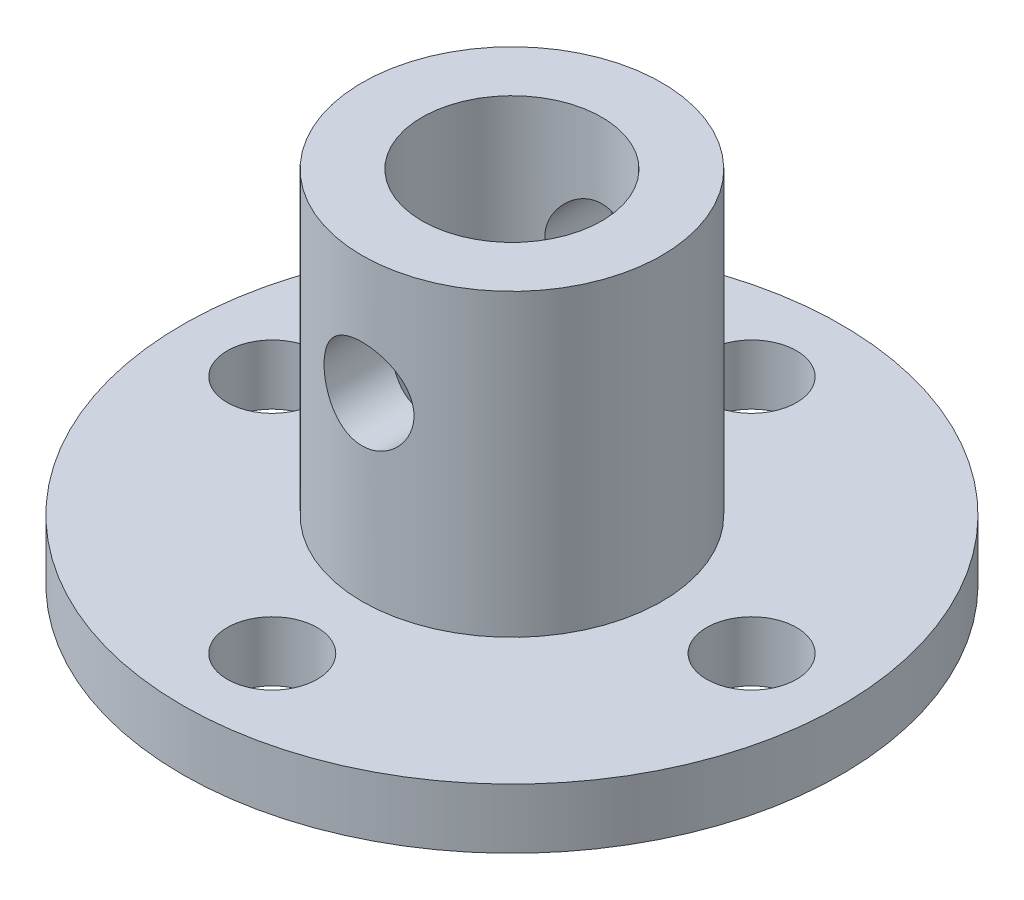
ISO-10303-21;
HEADER;
FILE_DESCRIPTION(('STEP AP214'),'2;1');
FILE_NAME('part.step','',(''),(''),'','','');
FILE_SCHEMA(('AUTOMOTIVE_DESIGN { 1 0 10303 214 1 1 1 1 }'));
ENDSEC;
DATA;
#1=APPLICATION_CONTEXT('core data for automotive mechanical design processes');
#2=APPLICATION_PROTOCOL_DEFINITION('international standard','automotive_design',2000,#1);
#3=PRODUCT_CONTEXT('',#1,'mechanical');
#4=PRODUCT('Part','Part','',(#3));
#5=PRODUCT_RELATED_PRODUCT_CATEGORY('part','',(#4));
#6=PRODUCT_DEFINITION_FORMATION('','',#4);
#7=PRODUCT_DEFINITION_CONTEXT('part definition',#1,'design');
#8=PRODUCT_DEFINITION('design','',#6,#7);
#9=PRODUCT_DEFINITION_SHAPE('','',#8);
#10=(LENGTH_UNIT() NAMED_UNIT(*) SI_UNIT(.MILLI.,.METRE.));
#11=(NAMED_UNIT(*) PLANE_ANGLE_UNIT() SI_UNIT($,.RADIAN.));
#12=(NAMED_UNIT(*) SI_UNIT($,.STERADIAN.) SOLID_ANGLE_UNIT());
#13=UNCERTAINTY_MEASURE_WITH_UNIT(LENGTH_MEASURE(1.E-05),#10,'distance_accuracy_value','');
#14=(GEOMETRIC_REPRESENTATION_CONTEXT(3) GLOBAL_UNCERTAINTY_ASSIGNED_CONTEXT((#13)) GLOBAL_UNIT_ASSIGNED_CONTEXT((#10,
#11,#12)) REPRESENTATION_CONTEXT('',''));
#15=CARTESIAN_POINT('',(0.,0.,0.));
#16=DIRECTION('',(0.,0.,1.));
#17=DIRECTION('',(1.,0.,0.));
#18=AXIS2_PLACEMENT_3D('',#15,#16,#17);
#19=CARTESIAN_POINT('',(0.,2.,0.));
#20=DIRECTION('',(0.,1.,0.));
#21=DIRECTION('',(0.,0.,1.));
#22=AXIS2_PLACEMENT_3D('',#19,#20,#21);
#23=PLANE('',#22);
#24=CARTESIAN_POINT('',(0.,2.,-8.));
#25=DIRECTION('',(0.,1.,0.));
#26=DIRECTION('',(0.,0.,1.));
#27=AXIS2_PLACEMENT_3D('',#24,#25,#26);
#28=CIRCLE('',#27,1.5);
#29=CARTESIAN_POINT('',(0.,2.,-6.5));
#30=VERTEX_POINT('',#29);
#31=EDGE_CURVE('E138',#30,#30,#28,.T.);
#32=ORIENTED_EDGE('',*,*,#31,.F.);
#33=EDGE_LOOP('',(#32));
#34=FACE_BOUND('',#33,.T.);
#35=CARTESIAN_POINT('',(0.,2.,8.));
#36=DIRECTION('',(0.,1.,0.));
#37=DIRECTION('',(0.,0.,1.));
#38=AXIS2_PLACEMENT_3D('',#35,#36,#37);
#39=CIRCLE('',#38,1.5);
#40=CARTESIAN_POINT('',(0.,2.,9.5));
#41=VERTEX_POINT('',#40);
#42=EDGE_CURVE('E156',#41,#41,#39,.T.);
#43=ORIENTED_EDGE('',*,*,#42,.F.);
#44=EDGE_LOOP('',(#43));
#45=FACE_BOUND('',#44,.T.);
#46=CARTESIAN_POINT('',(8.,2.,0.));
#47=DIRECTION('',(0.,1.,0.));
#48=DIRECTION('',(0.,0.,1.));
#49=AXIS2_PLACEMENT_3D('',#46,#47,#48);
#50=CIRCLE('',#49,1.5);
#51=CARTESIAN_POINT('',(8.,2.,1.5));
#52=VERTEX_POINT('',#51);
#53=EDGE_CURVE('E56',#52,#52,#50,.T.);
#54=ORIENTED_EDGE('',*,*,#53,.F.);
#55=EDGE_LOOP('',(#54));
#56=FACE_BOUND('',#55,.T.);
#57=CARTESIAN_POINT('',(0.,2.,0.));
#58=DIRECTION('',(0.,1.,0.));
#59=DIRECTION('',(0.,0.,1.));
#60=AXIS2_PLACEMENT_3D('',#57,#58,#59);
#61=CIRCLE('',#60,11.);
#62=CARTESIAN_POINT('',(0.,2.,11.));
#63=VERTEX_POINT('',#62);
#64=EDGE_CURVE('E10',#63,#63,#61,.T.);
#65=ORIENTED_EDGE('',*,*,#64,.T.);
#66=EDGE_LOOP('',(#65));
#67=FACE_BOUND('',#66,.T.);
#68=CARTESIAN_POINT('',(-8.,2.,0.));
#69=DIRECTION('',(0.,1.,0.));
#70=DIRECTION('',(0.,0.,1.));
#71=AXIS2_PLACEMENT_3D('',#68,#69,#70);
#72=CIRCLE('',#71,1.5);
#73=CARTESIAN_POINT('',(-8.,2.,1.5));
#74=VERTEX_POINT('',#73);
#75=EDGE_CURVE('E150',#74,#74,#72,.T.);
#76=ORIENTED_EDGE('',*,*,#75,.F.);
#77=EDGE_LOOP('',(#76));
#78=FACE_BOUND('',#77,.T.);
#79=CARTESIAN_POINT('',(0.,2.,0.));
#80=DIRECTION('',(0.,1.,0.));
#81=DIRECTION('',(0.,0.,1.));
#82=AXIS2_PLACEMENT_3D('',#79,#80,#81);
#83=CIRCLE('',#82,5.);
#84=CARTESIAN_POINT('',(0.,2.,5.));
#85=VERTEX_POINT('',#84);
#86=EDGE_CURVE('E146',#85,#85,#83,.T.);
#87=ORIENTED_EDGE('',*,*,#86,.F.);
#88=EDGE_LOOP('',(#87));
#89=FACE_BOUND('',#88,.T.);
#90=ADVANCED_FACE('F36',(#34,#45,#56,#67,#78,#89),#23,.T.);
#91=CARTESIAN_POINT('',(0.,0.,0.));
#92=DIRECTION('',(0.,1.,0.));
#93=DIRECTION('',(0.,0.,1.));
#94=AXIS2_PLACEMENT_3D('',#91,#92,#93);
#95=PLANE('',#94);
#96=CARTESIAN_POINT('',(0.,0.,0.));
#97=DIRECTION('',(0.,1.,0.));
#98=DIRECTION('',(0.,0.,1.));
#99=AXIS2_PLACEMENT_3D('',#96,#97,#98);
#100=CIRCLE('',#99,11.);
#101=CARTESIAN_POINT('',(0.,0.,11.));
#102=VERTEX_POINT('',#101);
#103=EDGE_CURVE('E50',#102,#102,#100,.T.);
#104=ORIENTED_EDGE('',*,*,#103,.F.);
#105=EDGE_LOOP('',(#104));
#106=FACE_BOUND('',#105,.T.);
#107=CARTESIAN_POINT('',(8.,0.,0.));
#108=DIRECTION('',(0.,1.,0.));
#109=DIRECTION('',(0.,0.,1.));
#110=AXIS2_PLACEMENT_3D('',#107,#108,#109);
#111=CIRCLE('',#110,1.5);
#112=CARTESIAN_POINT('',(8.,0.,1.5));
#113=VERTEX_POINT('',#112);
#114=EDGE_CURVE('E59',#113,#113,#111,.T.);
#115=ORIENTED_EDGE('',*,*,#114,.T.);
#116=EDGE_LOOP('',(#115));
#117=FACE_BOUND('',#116,.T.);
#118=CARTESIAN_POINT('',(0.,0.,0.));
#119=DIRECTION('',(0.,1.,0.));
#120=DIRECTION('',(0.,0.,1.));
#121=AXIS2_PLACEMENT_3D('',#118,#119,#120);
#122=CIRCLE('',#121,3.);
#123=CARTESIAN_POINT('',(0.,0.,3.));
#124=VERTEX_POINT('',#123);
#125=EDGE_CURVE('E124',#124,#124,#122,.T.);
#126=ORIENTED_EDGE('',*,*,#125,.T.);
#127=EDGE_LOOP('',(#126));
#128=FACE_BOUND('',#127,.T.);
#129=CARTESIAN_POINT('',(0.,0.,8.));
#130=DIRECTION('',(0.,1.,0.));
#131=DIRECTION('',(0.,0.,1.));
#132=AXIS2_PLACEMENT_3D('',#129,#130,#131);
#133=CIRCLE('',#132,1.5);
#134=CARTESIAN_POINT('',(0.,0.,9.5));
#135=VERTEX_POINT('',#134);
#136=EDGE_CURVE('E128',#135,#135,#133,.T.);
#137=ORIENTED_EDGE('',*,*,#136,.T.);
#138=EDGE_LOOP('',(#137));
#139=FACE_BOUND('',#138,.T.);
#140=CARTESIAN_POINT('',(-8.,0.,0.));
#141=DIRECTION('',(0.,1.,0.));
#142=DIRECTION('',(0.,0.,1.));
#143=AXIS2_PLACEMENT_3D('',#140,#141,#142);
#144=CIRCLE('',#143,1.5);
#145=CARTESIAN_POINT('',(-8.,0.,1.5));
#146=VERTEX_POINT('',#145);
#147=EDGE_CURVE('E132',#146,#146,#144,.T.);
#148=ORIENTED_EDGE('',*,*,#147,.T.);
#149=EDGE_LOOP('',(#148));
#150=FACE_BOUND('',#149,.T.);
#151=CARTESIAN_POINT('',(0.,0.,-8.));
#152=DIRECTION('',(0.,1.,0.));
#153=DIRECTION('',(0.,0.,1.));
#154=AXIS2_PLACEMENT_3D('',#151,#152,#153);
#155=CIRCLE('',#154,1.5);
#156=CARTESIAN_POINT('',(0.,0.,-6.5));
#157=VERTEX_POINT('',#156);
#158=EDGE_CURVE('E135',#157,#157,#155,.T.);
#159=ORIENTED_EDGE('',*,*,#158,.T.);
#160=EDGE_LOOP('',(#159));
#161=FACE_BOUND('',#160,.T.);
#162=ADVANCED_FACE('F108',(#106,#117,#128,#139,#150,#161),#95,.F.);
#163=CARTESIAN_POINT('',(0.,2.,0.));
#164=DIRECTION('',(0.,-1.,0.));
#165=DIRECTION('',(0.,0.,-1.));
#166=AXIS2_PLACEMENT_3D('',#163,#164,#165);
#167=CYLINDRICAL_SURFACE('',#166,11.);
#168=ORIENTED_EDGE('',*,*,#64,.F.);
#169=EDGE_LOOP('',(#168));
#170=FACE_BOUND('',#169,.T.);
#171=ORIENTED_EDGE('',*,*,#103,.T.);
#172=EDGE_LOOP('',(#171));
#173=FACE_BOUND('',#172,.T.);
#174=ADVANCED_FACE('F38',(#170,#173),#167,.T.);
#175=CARTESIAN_POINT('',(8.,2.,0.));
#176=DIRECTION('',(0.,-1.,0.));
#177=DIRECTION('',(0.,0.,-1.));
#178=AXIS2_PLACEMENT_3D('',#175,#176,#177);
#179=CYLINDRICAL_SURFACE('',#178,1.5);
#180=ORIENTED_EDGE('',*,*,#53,.T.);
#181=EDGE_LOOP('',(#180));
#182=FACE_BOUND('',#181,.T.);
#183=ORIENTED_EDGE('',*,*,#114,.F.);
#184=EDGE_LOOP('',(#183));
#185=FACE_BOUND('',#184,.T.);
#186=ADVANCED_FACE('F100',(#182,#185),#179,.F.);
#187=CARTESIAN_POINT('',(0.,2.,0.));
#188=DIRECTION('',(0.,-1.,0.));
#189=DIRECTION('',(0.,0.,-1.));
#190=AXIS2_PLACEMENT_3D('',#187,#188,#189);
#191=CYLINDRICAL_SURFACE('',#190,3.);
#192=CARTESIAN_POINT('',(0.,9.5,-3.));
#193=CARTESIAN_POINT('',(-0.0788579444268502,9.49999504652421,-2.99999570107562));
#194=CARTESIAN_POINT('',(-0.157809899546344,9.49374489031842,-2.99685736529635));
#195=CARTESIAN_POINT('',(-0.313380352903344,9.46902067948769,-2.98461234055736));
#196=CARTESIAN_POINT('',(-0.389994130070444,9.45052341050328,-2.97549431743379));
#197=CARTESIAN_POINT('',(-0.538400317320673,9.40220928707506,-2.95224419105063));
#198=CARTESIAN_POINT('',(-0.610210204408719,9.37243642362805,-2.93813158766306));
#199=CARTESIAN_POINT('',(-0.747708925209898,9.30264406795252,-2.90618664773642));
#200=CARTESIAN_POINT('',(-0.813398240985089,9.2626253836267,-2.88835460450288));
#201=CARTESIAN_POINT('',(-0.941261726642864,9.17072412577207,-2.84934387387093));
#202=CARTESIAN_POINT('',(-1.00298281668316,9.11827028114054,-2.82802798691306));
#203=CARTESIAN_POINT('',(-1.11716916730047,9.00421778112944,-2.78489955370115));
#204=CARTESIAN_POINT('',(-1.16962737466015,8.94261222234134,-2.76308664313552));
#205=CARTESIAN_POINT('',(-1.26787800067542,8.80627497571493,-2.71948426796021));
#206=CARTESIAN_POINT('',(-1.31283800332746,8.73089585248113,-2.69782780455198));
#207=CARTESIAN_POINT('',(-1.38925234033604,8.57244899602068,-2.65928968158481));
#208=CARTESIAN_POINT('',(-1.4207163224495,8.48938680691588,-2.64240461410484));
#209=CARTESIAN_POINT('',(-1.46719866328288,8.32300234186712,-2.61686800556713));
#210=CARTESIAN_POINT('',(-1.48308878562066,8.23999332189891,-2.6077840737557));
#211=CARTESIAN_POINT('',(-1.50064048996327,8.07203174333079,-2.59772834922792));
#212=CARTESIAN_POINT('',(-1.50231613255961,7.98708118869327,-2.59674854014932));
#213=CARTESIAN_POINT('',(-1.49203093075844,7.82857096352695,-2.60266395385873));
#214=CARTESIAN_POINT('',(-1.48167683930523,7.75486395316543,-2.6086314549302));
#215=CARTESIAN_POINT('',(-1.4504097735854,7.61041713594044,-2.62614343100775));
#216=CARTESIAN_POINT('',(-1.42949343584648,7.53967828204203,-2.63768968247664));
#217=CARTESIAN_POINT('',(-1.37731467057901,7.40115630115151,-2.66531214619112));
#218=CARTESIAN_POINT('',(-1.34582260067399,7.33348040182132,-2.68148760995998));
#219=CARTESIAN_POINT('',(-1.273562531502,7.20404856111499,-2.71655106422106));
#220=CARTESIAN_POINT('',(-1.2327903657187,7.14229529659987,-2.73544027170286));
#221=CARTESIAN_POINT('',(-1.13709908236918,7.01821812088516,-2.77669736854929));
#222=CARTESIAN_POINT('',(-1.08104168755392,6.95681468963576,-2.79920265355119));
#223=CARTESIAN_POINT('',(-0.95933336811206,6.84389687211365,-2.84321434950611));
#224=CARTESIAN_POINT('',(-0.893677884861428,6.79238721194918,-2.86472027938201));
#225=CARTESIAN_POINT('',(-0.750774758747772,6.69847150845541,-2.90552980924446));
#226=CARTESIAN_POINT('',(-0.673130387399113,6.65659929133139,-2.92468476243011));
#227=CARTESIAN_POINT('',(-0.510699323233195,6.58685445643549,-2.95736821681863));
#228=CARTESIAN_POINT('',(-0.425918364397913,6.55897072247725,-2.9709011841533));
#229=CARTESIAN_POINT('',(-0.259149737491053,6.52028689442498,-2.98986500612153));
#230=CARTESIAN_POINT('',(-0.177512295822489,6.50826314637983,-2.99587407451965));
#231=CARTESIAN_POINT('',(-0.0131693999240276,6.49780290329827,-3.00109520188655));
#232=CARTESIAN_POINT('',(0.069535529804863,6.4993599715408,-3.00031048081978));
#233=CARTESIAN_POINT('',(0.22684945797898,6.51531003262812,-2.99236788380152));
#234=CARTESIAN_POINT('',(0.301589112074895,6.52869879909499,-2.98570868532253));
#235=CARTESIAN_POINT('',(0.447610338452911,6.56635710784268,-2.9673325697226));
#236=CARTESIAN_POINT('',(0.51889152853663,6.59062784968024,-2.95561509501618));
#237=CARTESIAN_POINT('',(0.658332912674359,6.64999769964955,-2.92776377120382));
#238=CARTESIAN_POINT('',(0.726345595508704,6.68538657517443,-2.91151322654446));
#239=CARTESIAN_POINT('',(0.855692042548907,6.76566130346985,-2.87615961476126));
#240=CARTESIAN_POINT('',(0.917022944664887,6.81055120189309,-2.85705533350407));
#241=CARTESIAN_POINT('',(1.03765153393382,6.91364063799607,-2.81562332004297));
#242=CARTESIAN_POINT('',(1.09615811672854,6.97271430266772,-2.79316327265249));
#243=CARTESIAN_POINT('',(1.20278448167828,7.09988772691659,-2.7489358741323));
#244=CARTESIAN_POINT('',(1.25089707856781,7.16799367827188,-2.72716901100071));
#245=CARTESIAN_POINT('',(1.33756187171853,7.31546548125946,-2.68576788309734));
#246=CARTESIAN_POINT('',(1.37553824370037,7.39521689914172,-2.66628794383591));
#247=CARTESIAN_POINT('',(1.43712423890206,7.56126510136245,-2.63361108441202));
#248=CARTESIAN_POINT('',(1.46075237380052,7.64755328970034,-2.62040607332625));
#249=CARTESIAN_POINT('',(1.49079253120031,7.81536533432706,-2.60342251538703));
#250=CARTESIAN_POINT('',(1.49863949460818,7.89655138015286,-2.59886075197597));
#251=CARTESIAN_POINT('',(1.5010337315643,8.05917060074679,-2.59748031962405));
#252=CARTESIAN_POINT('',(1.49558676993486,8.14060365310679,-2.60065829439585));
#253=CARTESIAN_POINT('',(1.47288918838996,8.29322525230016,-2.61356793076615));
#254=CARTESIAN_POINT('',(1.45681247151455,8.36465070521711,-2.62264641723988));
#255=CARTESIAN_POINT('',(1.41476303733662,8.50371217913655,-2.64556524281479));
#256=CARTESIAN_POINT('',(1.38878713673988,8.57134697313805,-2.65940711354503));
#257=CARTESIAN_POINT('',(1.32572361795085,8.7059372764798,-2.69142795546804));
#258=CARTESIAN_POINT('',(1.28800670672355,8.77254185274354,-2.70983583593881));
#259=CARTESIAN_POINT('',(1.20322645745609,8.89891180427189,-2.74852997452291));
#260=CARTESIAN_POINT('',(1.15615825686234,8.95867359578167,-2.76881720693416));
#261=CARTESIAN_POINT('',(1.04730498999206,9.07721297353201,-2.81193484737138));
#262=CARTESIAN_POINT('',(0.98442663449589,9.13498865352544,-2.83477474959942));
#263=CARTESIAN_POINT('',(0.849232209349794,9.2393944751529,-2.87816628389896));
#264=CARTESIAN_POINT('',(0.776911084957794,9.28601860920486,-2.89871667939293));
#265=CARTESIAN_POINT('',(0.623897395174417,9.36685454406811,-2.93547014349806));
#266=CARTESIAN_POINT('',(0.543149255665095,9.4009762538547,-2.95164144740899));
#267=CARTESIAN_POINT('',(0.376113151707128,9.45471225163612,-2.9775201194848));
#268=CARTESIAN_POINT('',(0.289841699383649,9.47436777020857,-2.98724585044602));
#269=CARTESIAN_POINT('',(0.168902919736341,9.49084611662861,-2.99543192870217));
#270=CARTESIAN_POINT('',(0.135242819162346,9.49427396129951,-2.99714048010376));
#271=CARTESIAN_POINT('',(0.0677275977076369,9.49885199827113,-2.99942545465223));
#272=CARTESIAN_POINT('',(0.0338724714699424,9.50000212770531,-3.00000184655071));
#273=CARTESIAN_POINT('',(0.,9.5,-3.));
#274=B_SPLINE_CURVE_WITH_KNOTS('',3,(#192,#193,#194,#195,#196,#197,#198,#199,#200,#201,#202,
#203,#204,#205,#206,#207,#208,#209,#210,#211,#212,#213,#214,#215,#216,#217,#218,#219,#220,#221,
#222,#223,#224,#225,#226,#227,#228,#229,#230,#231,#232,#233,#234,#235,#236,#237,#238,#239,#240,
#241,#242,#243,#244,#245,#246,#247,#248,#249,#250,#251,#252,#253,#254,#255,#256,#257,#258,#259,
#260,#261,#262,#263,#264,#265,#266,#267,#268,#269,#270,#271,#272,#273),.UNSPECIFIED.,.T.,.F.,(4,
2,2,2,2,2,2,2,2,2,2,2,2,2,2,2,2,2,2,2,2,2,2,2,2,2,2,2,2,2,2,2,2,2,2,2,2,2,2,2,4),(0.,
0.236436386130439,0.473322224563796,0.709293233238448,0.945245640872351,1.19547263807713,
1.44588935648105,1.71572589646129,1.98536921847421,2.23887018210344,2.49212035993531,
2.71508568613981,2.93812205888518,3.16635360252731,3.39468781890333,3.65197412000818,
3.90938301898029,4.17874533321661,4.44789325368419,4.69474935707018,4.94148846767214,
5.16910359759183,5.39674382446397,5.63089284041848,5.86514176122509,6.12239415966628,
6.37982382923148,6.64972023242589,6.91926767918176,7.1629396125457,7.40650589797018,
7.62686895373284,7.84730293182526,8.08254685170431,8.31791341715446,8.58187864135757,
8.84598575071869,9.1119602049529,9.37717362931724,9.47872920200875,9.58028757766599),.UNSPECIFIED.);
#275=CARTESIAN_POINT('',(0.,9.5,-3.));
#276=VERTEX_POINT('',#275);
#277=EDGE_CURVE('E89',#276,#276,#274,.T.);
#278=ORIENTED_EDGE('',*,*,#277,.F.);
#279=EDGE_LOOP('',(#278));
#280=FACE_BOUND('',#279,.T.);
#281=CARTESIAN_POINT('',(1.5,8.,2.59807621135332));
#282=CARTESIAN_POINT('',(1.4999945446118,7.92183828770712,2.59808302092689));
#283=CARTESIAN_POINT('',(1.49384995609983,7.84357788271243,2.60165701781635));
#284=CARTESIAN_POINT('',(1.46958481484708,7.68945910298427,2.61543549678079));
#285=CARTESIAN_POINT('',(1.45143909683127,7.61360612743489,2.62565391083339));
#286=CARTESIAN_POINT('',(1.40414992304972,7.46682250348409,2.65124019908098));
#287=CARTESIAN_POINT('',(1.3750649287406,7.39586802128962,2.66658065209878));
#288=CARTESIAN_POINT('',(1.30690128806456,7.25986369700492,2.70063997225287));
#289=CARTESIAN_POINT('',(1.26782210105366,7.19481417460631,2.71935902214097));
#290=CARTESIAN_POINT('',(1.17699981079632,7.06654140716374,2.75995303586162));
#291=CARTESIAN_POINT('',(1.12447805421566,7.00391129648968,2.7819609545693));
#292=CARTESIAN_POINT('',(1.0098807114217,6.88788741738994,2.82557974178559));
#293=CARTESIAN_POINT('',(0.94780038867344,6.83449825612472,2.84719040746875));
#294=CARTESIAN_POINT('',(0.81073434512182,6.73494927327851,2.88932215429424));
#295=CARTESIAN_POINT('',(0.735160783518862,6.68951934821071,2.90967159627259));
#296=CARTESIAN_POINT('',(0.576235539899256,6.61228872013136,2.94526134149293));
#297=CARTESIAN_POINT('',(0.492888807207233,6.58047941579424,2.96050486775612));
#298=CARTESIAN_POINT('',(0.327067415888966,6.53374300804835,2.98320691866356));
#299=CARTESIAN_POINT('',(0.244952685733227,6.5177757104667,2.99114220331338));
#300=CARTESIAN_POINT('',(0.0788559430467724,6.49975082198744,3.00011375769101));
#301=CARTESIAN_POINT('',(-0.00512490876560767,6.49768481480643,3.00115420176885));
#302=CARTESIAN_POINT('',(-0.164748786635625,6.50712001095552,2.99644472874675));
#303=CARTESIAN_POINT('',(-0.240481798765187,6.51745702328183,2.99127743838241));
#304=CARTESIAN_POINT('',(-0.388970657877483,6.54932126585699,2.97561367889621));
#305=CARTESIAN_POINT('',(-0.461726281640888,6.57084933346434,2.96511681099591));
#306=CARTESIAN_POINT('',(-0.603464087354331,6.62462384913472,2.93957374931482));
#307=CARTESIAN_POINT('',(-0.672380135272768,6.6570144697581,2.92446662293799));
#308=CARTESIAN_POINT('',(-0.803965202269993,6.73139512430224,2.89106468980031));
#309=CARTESIAN_POINT('',(-0.866631973257969,6.77338859495352,2.87276874236226));
#310=CARTESIAN_POINT('',(-0.990260491347293,6.87034302729952,2.83266591598844));
#311=CARTESIAN_POINT('',(-1.05050111254404,6.92615454248902,2.81069063997263));
#312=CARTESIAN_POINT('',(-1.16115655544667,7.04688458739527,2.76681510880218));
#313=CARTESIAN_POINT('',(-1.21156381736135,7.11181005841109,2.74491492398443));
#314=CARTESIAN_POINT('',(-1.30425800196332,7.25397228863613,2.70216234138727));
#315=CARTESIAN_POINT('',(-1.34582597246708,7.33172903458132,2.68146479986061));
#316=CARTESIAN_POINT('',(-1.41497866950185,7.4944065070385,2.64563175417864));
#317=CARTESIAN_POINT('',(-1.44257798731633,7.57931964952634,2.63049045069101));
#318=CARTESIAN_POINT('',(-1.48077031653756,7.74682176692419,2.60916953725552));
#319=CARTESIAN_POINT('',(-1.49253768317996,7.82906167856533,2.60237483772745));
#320=CARTESIAN_POINT('',(-1.50227541991714,7.99460201227481,2.59676879042414));
#321=CARTESIAN_POINT('',(-1.50025553597254,8.07790164367968,2.59795180333967));
#322=CARTESIAN_POINT('',(-1.48355406501595,8.23348087786809,2.60751504810877));
#323=CARTESIAN_POINT('',(-1.4702817250687,8.30596917666189,2.61509381259981));
#324=CARTESIAN_POINT('',(-1.43354442694866,8.44755167940644,2.63541032327012));
#325=CARTESIAN_POINT('',(-1.41007616793542,8.51664477611991,2.64814974007551));
#326=CARTESIAN_POINT('',(-1.35247138290733,8.65311699635404,2.67804333119485));
#327=CARTESIAN_POINT('',(-1.31789109553909,8.72026852528033,2.69537464864595));
#328=CARTESIAN_POINT('',(-1.23943059602371,8.84820390730849,2.73234179245875));
#329=CARTESIAN_POINT('',(-1.19554560649832,8.90898446526992,2.75197880032721));
#330=CARTESIAN_POINT('',(-1.09325575079828,9.03046815128532,2.79431997684504));
#331=CARTESIAN_POINT('',(-1.03371790847245,9.09019572607649,2.81709874731434));
#332=CARTESIAN_POINT('',(-0.905106743097433,9.19911835699039,2.86101352466839));
#333=CARTESIAN_POINT('',(-0.83603021198302,9.24830985534581,2.88214897511564));
#334=CARTESIAN_POINT('',(-0.687803043838135,9.33586058892515,2.92112042536435));
#335=CARTESIAN_POINT('',(-0.60843464636117,9.37389967731637,2.93885462508044));
#336=CARTESIAN_POINT('',(-0.443283546961623,9.43570685578609,2.96825032438951));
#337=CARTESIAN_POINT('',(-0.357506552088264,9.45948747704946,2.9799171551456));
#338=CARTESIAN_POINT('',(-0.190469523495625,9.49005284626199,2.99501262272824));
#339=CARTESIAN_POINT('',(-0.109517165775685,9.49819681381417,2.99909891862287));
#340=CARTESIAN_POINT('',(0.0526889789268059,9.5012648981816,3.00063195562697));
#341=CARTESIAN_POINT('',(0.133942650442631,9.49619364278535,2.99808102100335));
#342=CARTESIAN_POINT('',(0.288806988475721,9.47387538980657,2.98700953256884));
#343=CARTESIAN_POINT('',(0.362568476716896,9.45745272611349,2.97889342001985));
#344=CARTESIAN_POINT('',(0.506168928275426,9.41400950104554,2.95788140495135));
#345=CARTESIAN_POINT('',(0.576007327433263,9.38698741985982,2.94498481699194));
#346=CARTESIAN_POINT('',(0.713135109367327,9.32190942175104,2.9148889612218));
#347=CARTESIAN_POINT('',(0.78018771405007,9.28343101518824,2.89752925798199));
#348=CARTESIAN_POINT('',(0.907161962721037,9.19706310371143,2.86032199712739));
#349=CARTESIAN_POINT('',(0.967080311122361,9.14916927632649,2.84047329837541));
#350=CARTESIAN_POINT('',(1.08437100623534,9.03980429146594,2.79792915339941));
#351=CARTESIAN_POINT('',(1.14089652680891,8.97745626878421,2.77514698517547));
#352=CARTESIAN_POINT('',(1.24299493109201,8.84382391830534,2.73094614244278));
#353=CARTESIAN_POINT('',(1.28855812501509,8.77253176869847,2.70952868642798));
#354=CARTESIAN_POINT('',(1.36864661967848,8.62004503012857,2.66999407957374));
#355=CARTESIAN_POINT('',(1.40277759894141,8.5386087033069,2.65200261384405));
#356=CARTESIAN_POINT('',(1.45631806425962,8.37000139349033,2.62299234492527));
#357=CARTESIAN_POINT('',(1.47577678676302,8.28285066663097,2.61195024221553));
#358=CARTESIAN_POINT('',(1.49155051179662,8.162291966522,2.60293908902686));
#359=CARTESIAN_POINT('',(1.49471415744578,8.12994815840317,2.60112193507728));
#360=CARTESIAN_POINT('',(1.49894010763494,8.06507527897663,2.59868903831625));
#361=CARTESIAN_POINT('',(1.50000227159981,8.03254619542119,2.59807337587664));
#362=CARTESIAN_POINT('',(1.5,8.,2.59807621135332));
#363=B_SPLINE_CURVE_WITH_KNOTS('',3,(#281,#282,#283,#284,#285,#286,#287,#288,#289,#290,#291,
#292,#293,#294,#295,#296,#297,#298,#299,#300,#301,#302,#303,#304,#305,#306,#307,#308,#309,#310,
#311,#312,#313,#314,#315,#316,#317,#318,#319,#320,#321,#322,#323,#324,#325,#326,#327,#328,#329,
#330,#331,#332,#333,#334,#335,#336,#337,#338,#339,#340,#341,#342,#343,#344,#345,#346,#347,#348,
#349,#350,#351,#352,#353,#354,#355,#356,#357,#358,#359,#360,#361,#362),.UNSPECIFIED.,.T.,.F.,(4,
2,2,2,2,2,2,2,2,2,2,2,2,2,2,2,2,2,2,2,2,2,2,2,2,2,2,2,2,2,2,2,2,2,2,2,2,2,2,2,4),(0.,
0.234348183892073,0.469189339237207,0.702792893878328,0.936409088167724,1.18929346874735,
1.44230356626556,1.71236838358145,1.98226240445836,2.23295227451903,2.4834903552906,
2.71224146226808,2.94100968776183,3.1729430209672,3.40495949025408,3.65890787185336,
3.91305072368878,4.18333262594173,4.45333161317557,4.70193436281317,4.95036139782559,
5.17161275136038,5.39293578654094,5.62450944609131,5.85620229330071,6.1171011537092,
6.37808797467303,6.64596272119449,6.91360169713157,7.1566840558423,7.39968130190957,
7.62666637307239,7.8536840026802,8.09041126079208,8.32724745151079,8.58765362775102,
8.84828914267732,9.11716123557908,9.38512699504141,9.48270202777964,9.58028358741811),.UNSPECIFIED.);
#364=CARTESIAN_POINT('',(1.5,8.,2.59807621135332));
#365=VERTEX_POINT('',#364);
#366=EDGE_CURVE('E82',#365,#365,#363,.T.);
#367=ORIENTED_EDGE('',*,*,#366,.F.);
#368=EDGE_LOOP('',(#367));
#369=FACE_BOUND('',#368,.T.);
#370=ORIENTED_EDGE('',*,*,#125,.F.);
#371=EDGE_LOOP('',(#370));
#372=FACE_BOUND('',#371,.T.);
#373=CARTESIAN_POINT('',(0.,12.,0.));
#374=DIRECTION('',(0.,1.,0.));
#375=DIRECTION('',(0.,0.,1.));
#376=AXIS2_PLACEMENT_3D('',#373,#374,#375);
#377=CIRCLE('',#376,3.);
#378=CARTESIAN_POINT('',(0.,12.,3.));
#379=VERTEX_POINT('',#378);
#380=EDGE_CURVE('E176',#379,#379,#377,.T.);
#381=ORIENTED_EDGE('',*,*,#380,.T.);
#382=EDGE_LOOP('',(#381));
#383=FACE_BOUND('',#382,.T.);
#384=ADVANCED_FACE('F94',(#280,#369,#372,#383),#191,.F.);
#385=CARTESIAN_POINT('',(0.,2.,8.));
#386=DIRECTION('',(0.,-1.,0.));
#387=DIRECTION('',(0.,0.,-1.));
#388=AXIS2_PLACEMENT_3D('',#385,#386,#387);
#389=CYLINDRICAL_SURFACE('',#388,1.5);
#390=ORIENTED_EDGE('',*,*,#42,.T.);
#391=EDGE_LOOP('',(#390));
#392=FACE_BOUND('',#391,.T.);
#393=ORIENTED_EDGE('',*,*,#136,.F.);
#394=EDGE_LOOP('',(#393));
#395=FACE_BOUND('',#394,.T.);
#396=ADVANCED_FACE('F99',(#392,#395),#389,.F.);
#397=CARTESIAN_POINT('',(-8.,2.,0.));
#398=DIRECTION('',(0.,-1.,0.));
#399=DIRECTION('',(0.,0.,-1.));
#400=AXIS2_PLACEMENT_3D('',#397,#398,#399);
#401=CYLINDRICAL_SURFACE('',#400,1.5);
#402=ORIENTED_EDGE('',*,*,#75,.T.);
#403=EDGE_LOOP('',(#402));
#404=FACE_BOUND('',#403,.T.);
#405=ORIENTED_EDGE('',*,*,#147,.F.);
#406=EDGE_LOOP('',(#405));
#407=FACE_BOUND('',#406,.T.);
#408=ADVANCED_FACE('F205',(#404,#407),#401,.F.);
#409=CARTESIAN_POINT('',(0.,2.,-8.));
#410=DIRECTION('',(0.,-1.,0.));
#411=DIRECTION('',(0.,0.,-1.));
#412=AXIS2_PLACEMENT_3D('',#409,#410,#411);
#413=CYLINDRICAL_SURFACE('',#412,1.5);
#414=ORIENTED_EDGE('',*,*,#31,.T.);
#415=EDGE_LOOP('',(#414));
#416=FACE_BOUND('',#415,.T.);
#417=ORIENTED_EDGE('',*,*,#158,.F.);
#418=EDGE_LOOP('',(#417));
#419=FACE_BOUND('',#418,.T.);
#420=ADVANCED_FACE('F200',(#416,#419),#413,.F.);
#421=CARTESIAN_POINT('',(0.,12.,0.));
#422=DIRECTION('',(0.,1.,0.));
#423=DIRECTION('',(0.,0.,1.));
#424=AXIS2_PLACEMENT_3D('',#421,#422,#423);
#425=PLANE('',#424);
#426=CARTESIAN_POINT('',(0.,12.,0.));
#427=DIRECTION('',(0.,1.,0.));
#428=DIRECTION('',(0.,0.,1.));
#429=AXIS2_PLACEMENT_3D('',#426,#427,#428);
#430=CIRCLE('',#429,5.);
#431=CARTESIAN_POINT('',(0.,12.,5.));
#432=VERTEX_POINT('',#431);
#433=EDGE_CURVE('E139',#432,#432,#430,.T.);
#434=ORIENTED_EDGE('',*,*,#433,.T.);
#435=EDGE_LOOP('',(#434));
#436=FACE_BOUND('',#435,.T.);
#437=ORIENTED_EDGE('',*,*,#380,.F.);
#438=EDGE_LOOP('',(#437));
#439=FACE_BOUND('',#438,.T.);
#440=ADVANCED_FACE('F76',(#436,#439),#425,.T.);
#441=CARTESIAN_POINT('',(0.,12.,0.));
#442=DIRECTION('',(0.,-1.,0.));
#443=DIRECTION('',(0.,0.,-1.));
#444=AXIS2_PLACEMENT_3D('',#441,#442,#443);
#445=CYLINDRICAL_SURFACE('',#444,5.);
#446=CARTESIAN_POINT('',(0.,9.5,-5.));
#447=CARTESIAN_POINT('',(-0.0822886127533,9.49999900251511,-4.9999992925055));
#448=CARTESIAN_POINT('',(-0.164587318351529,9.49320613637603,-4.99794915693954));
#449=CARTESIAN_POINT('',(-0.326788125304881,9.4662786457779,-4.98997105593691));
#450=CARTESIAN_POINT('',(-0.40668950441142,9.44614004197666,-4.98404193389692));
#451=CARTESIAN_POINT('',(-0.561732707754526,9.39325398308974,-4.96895552501836));
#452=CARTESIAN_POINT('',(-0.636881364395373,9.36052513038106,-4.95980300250425));
#453=CARTESIAN_POINT('',(-0.780624181053131,9.28346390694416,-4.93922109237645));
#454=CARTESIAN_POINT('',(-0.849217467469669,9.23912999260458,-4.92779140192067));
#455=CARTESIAN_POINT('',(-0.979871797183745,9.13877599252733,-4.90350737192774));
#456=CARTESIAN_POINT('',(-1.04171807124434,9.08248337411409,-4.89062383657036));
#457=CARTESIAN_POINT('',(-1.15524920923324,8.96039077008982,-4.86505834210442));
#458=CARTESIAN_POINT('',(-1.20693236327441,8.89458918787504,-4.85237641724501));
#459=CARTESIAN_POINT('',(-1.29980037723708,8.75352924696239,-4.82834113993772));
#460=CARTESIAN_POINT('',(-1.34072309022213,8.67809153900926,-4.81702406663875));
#461=CARTESIAN_POINT('',(-1.4092139477476,8.52101074576971,-4.79743620394031));
#462=CARTESIAN_POINT('',(-1.43678529919973,8.43936915607203,-4.78916468313311));
#463=CARTESIAN_POINT('',(-1.47701633682652,8.27460973386954,-4.77690870838434));
#464=CARTESIAN_POINT('',(-1.49007196234677,8.19159725613606,-4.77281069324533));
#465=CARTESIAN_POINT('',(-1.50213730614672,8.02446684378324,-4.76902789749767));
#466=CARTESIAN_POINT('',(-1.50115042761078,7.94034918194092,-4.76934204760571));
#467=CARTESIAN_POINT('',(-1.48546977199812,7.77661609139152,-4.77424744067778));
#468=CARTESIAN_POINT('',(-1.47127205262685,7.69694774963776,-4.7786838859914));
#469=CARTESIAN_POINT('',(-1.43037420427056,7.54118021372654,-4.79108356228624));
#470=CARTESIAN_POINT('',(-1.40367284141641,7.46508137262567,-4.79904714132351));
#471=CARTESIAN_POINT('',(-1.33816026653682,7.31739965033926,-4.81772733074973));
#472=CARTESIAN_POINT('',(-1.29918816934642,7.24589291604474,-4.82848016115952));
#473=CARTESIAN_POINT('',(-1.21035222588683,7.11026797798981,-4.85150987000065));
#474=CARTESIAN_POINT('',(-1.16048574002588,7.04615157058622,-4.86378711746991));
#475=CARTESIAN_POINT('',(-1.04881290765546,6.92431380923798,-4.88911011297937));
#476=CARTESIAN_POINT('',(-0.986594907466972,6.86697133597033,-4.90216654310498));
#477=CARTESIAN_POINT('',(-0.853263259313967,6.76344601593575,-4.92712244063259));
#478=CARTESIAN_POINT('',(-0.782149051860888,6.71726387158557,-4.9390218351841));
#479=CARTESIAN_POINT('',(-0.632355038342804,6.63714007753527,-4.9604316006947));
#480=CARTESIAN_POINT('',(-0.553627749747951,6.60328248375014,-4.96992543668314));
#481=CARTESIAN_POINT('',(-0.39124541560352,6.54940040990037,-4.98533521832222));
#482=CARTESIAN_POINT('',(-0.307591751589582,6.52937207146751,-4.99125216186999));
#483=CARTESIAN_POINT('',(-0.140952242668332,6.50434782210061,-4.99868364643538));
#484=CARTESIAN_POINT('',(-0.0580500976011875,6.49883841419839,-5.0003485041779));
#485=CARTESIAN_POINT('',(0.107499605823382,6.50156915571208,-4.9995292324176));
#486=CARTESIAN_POINT('',(0.19014719669078,6.50980746965144,-4.99704565677756));
#487=CARTESIAN_POINT('',(0.350903605309696,6.5393846111115,-4.98830696987163));
#488=CARTESIAN_POINT('',(0.429072772614168,6.56042338758087,-4.98213829799417));
#489=CARTESIAN_POINT('',(0.580754638954521,6.6146432327782,-4.96674347841533));
#490=CARTESIAN_POINT('',(0.654266777025583,6.64782576103786,-4.95751696321085));
#491=CARTESIAN_POINT('',(0.796437189461052,6.72625316548113,-4.93669654351325));
#492=CARTESIAN_POINT('',(0.864943826199669,6.77175934094797,-4.92505280829675));
#493=CARTESIAN_POINT('',(0.993523307980146,6.87322475405281,-4.90073468764318));
#494=CARTESIAN_POINT('',(1.05359403235593,6.92918661188767,-4.8880600443108));
#495=CARTESIAN_POINT('',(1.16585744551027,7.05238730836934,-4.86253171869138));
#496=CARTESIAN_POINT('',(1.21768481231503,7.11996187577174,-4.84968825033268));
#497=CARTESIAN_POINT('',(1.30928995072153,7.26312793901353,-4.82576515238464));
#498=CARTESIAN_POINT('',(1.34906803829472,7.33871922455821,-4.81468547654651));
#499=CARTESIAN_POINT('',(1.41517347127168,7.49553249125469,-4.79567189615055));
#500=CARTESIAN_POINT('',(1.4415634693705,7.57672618653659,-4.78772337843827));
#501=CARTESIAN_POINT('',(1.48021730815114,7.74268796893148,-4.77591594362794));
#502=CARTESIAN_POINT('',(1.49248598978779,7.82745482078767,-4.772055625083));
#503=CARTESIAN_POINT('',(1.50221984485059,7.99436151837623,-4.76899972496087));
#504=CARTESIAN_POINT('',(1.5002805530849,8.07646365101758,-4.76961647442755));
#505=CARTESIAN_POINT('',(1.48307505444813,8.2391141033728,-4.77499401288294));
#506=CARTESIAN_POINT('',(1.46780938124716,8.31966248517635,-4.77975463592551));
#507=CARTESIAN_POINT('',(1.42476888804136,8.47594539914285,-4.79275763670385));
#508=CARTESIAN_POINT('',(1.39715175507068,8.55172728736169,-4.80095604545965));
#509=CARTESIAN_POINT('',(1.33031507121129,8.69764243881772,-4.81990278909136));
#510=CARTESIAN_POINT('',(1.29109329962876,8.76777461764076,-4.83065161194312));
#511=CARTESIAN_POINT('',(1.20048763805072,8.90316311652711,-4.85397676425833));
#512=CARTESIAN_POINT('',(1.14871276092994,8.96814876126041,-4.86660540163798));
#513=CARTESIAN_POINT('',(1.03517434629782,9.08870249830786,-4.89201320450026));
#514=CARTESIAN_POINT('',(0.973408217134502,9.14426813946775,-4.90479240823905));
#515=CARTESIAN_POINT('',(0.839465762183249,9.24602341229503,-4.92950936570649));
#516=CARTESIAN_POINT('',(0.767037885790609,9.29189144685549,-4.94141159765674));
#517=CARTESIAN_POINT('',(0.615141373983531,9.37073516990402,-4.96260680455813));
#518=CARTESIAN_POINT('',(0.535676052998956,9.40371688827451,-4.97190099931067));
#519=CARTESIAN_POINT('',(0.380757712655283,9.45289527565275,-4.98602174969301));
#520=CARTESIAN_POINT('',(0.305786961954236,9.47051167288325,-4.99122027381068));
#521=CARTESIAN_POINT('',(0.15388019523078,9.49406352524158,-4.99820944494492));
#522=CARTESIAN_POINT('',(0.0769445098581401,9.50000093270482,-5.0000006615474));
#523=CARTESIAN_POINT('',(0.,9.5,-5.));
#524=B_SPLINE_CURVE_WITH_KNOTS('',3,(#446,#447,#448,#449,#450,#451,#452,#453,#454,#455,#456,
#457,#458,#459,#460,#461,#462,#463,#464,#465,#466,#467,#468,#469,#470,#471,#472,#473,#474,#475,
#476,#477,#478,#479,#480,#481,#482,#483,#484,#485,#486,#487,#488,#489,#490,#491,#492,#493,#494,
#495,#496,#497,#498,#499,#500,#501,#502,#503,#504,#505,#506,#507,#508,#509,#510,#511,#512,#513,
#514,#515,#516,#517,#518,#519,#520,#521,#522,#523),.UNSPECIFIED.,.T.,.F.,(4,2,2,2,2,2,2,2,2,2,2,
2,2,2,2,2,2,2,2,2,2,2,2,2,2,2,2,2,2,2,2,2,2,2,2,2,2,2,4),(0.,0.246583203612611,
0.493239964845999,0.739533676300874,0.985860164412702,1.23855602948191,1.49129437288633,
1.74971481004109,2.00807314543223,2.25919689356599,2.51025978319089,2.75226016697676,
2.99428443658001,3.23962426447119,3.48502360158555,3.74067104048166,3.99633456531071,
4.25371046881688,4.51101453528808,4.75908809438545,5.00712853550327,5.24956746682327,
5.49203554593728,5.74011305702908,5.98825282000191,6.24540400322818,6.5025484425268,
6.75847814951252,7.01432009460283,7.25950155466942,7.504673196616,7.74680040402721,
7.98897397553107,8.2399692567993,8.49102974897502,8.74942996156671,9.00770911595235,
9.23831691930459,9.46888616948875),.UNSPECIFIED.);
#525=CARTESIAN_POINT('',(0.,9.5,-5.));
#526=VERTEX_POINT('',#525);
#527=EDGE_CURVE('E40',#526,#526,#524,.T.);
#528=ORIENTED_EDGE('',*,*,#527,.T.);
#529=EDGE_LOOP('',(#528));
#530=FACE_BOUND('',#529,.T.);
#531=CARTESIAN_POINT('',(1.5,8.,4.76969600708473));
#532=CARTESIAN_POINT('',(1.49999897633764,7.9178054520576,4.7696968572698));
#533=CARTESIAN_POINT('',(1.49322108167142,7.83560077585598,4.77184390209069));
#534=CARTESIAN_POINT('',(1.46635844446749,7.67359475040806,4.780165783029));
#535=CARTESIAN_POINT('',(1.44626925573578,7.59379421349854,4.78634196493468));
#536=CARTESIAN_POINT('',(1.39352753269955,7.43896527172827,4.80196102485633));
#537=CARTESIAN_POINT('',(1.36089589394243,7.36392917036691,4.81139846703232));
#538=CARTESIAN_POINT('',(1.28406421917929,7.2203780660047,4.83246932547567));
#539=CARTESIAN_POINT('',(1.23986245137053,7.15186404131556,4.84410307041019));
#540=CARTESIAN_POINT('',(1.13964754141627,7.02113360942263,4.86866862185765));
#541=CARTESIAN_POINT('',(1.08333207175807,6.95915410205371,4.88162808311636));
#542=CARTESIAN_POINT('',(0.961136237579598,6.84536204867749,4.90714861936757));
#543=CARTESIAN_POINT('',(0.895254645461111,6.79355080955012,4.91970964297705));
#544=CARTESIAN_POINT('',(0.754111437793689,6.70053730016669,4.94333214579389));
#545=CARTESIAN_POINT('',(0.678684021335814,6.65957657555719,4.95435724342404));
#546=CARTESIAN_POINT('',(0.521624645369353,6.59101274095724,4.97334435920684));
#547=CARTESIAN_POINT('',(0.439994028387911,6.56340675014255,4.98130703789495));
#548=CARTESIAN_POINT('',(0.275323852630829,6.52311999890949,4.99307646003589));
#549=CARTESIAN_POINT('',(0.1923913989538,6.5100348723473,4.99699557369338));
#550=CARTESIAN_POINT('',(0.0254218237493143,6.49788267535356,5.00063201501348));
#551=CARTESIAN_POINT('',(-0.058615062050369,6.49881266059804,5.00035022521079));
#552=CARTESIAN_POINT('',(-0.222571156600161,6.51439286854302,4.99569603817659));
#553=CARTESIAN_POINT('',(-0.302536267641342,6.52860519380987,4.9914542020526));
#554=CARTESIAN_POINT('',(-0.458889213442527,6.56963133599429,4.97951522112593));
#555=CARTESIAN_POINT('',(-0.535276821322846,6.59644595094267,4.97181785750586));
#556=CARTESIAN_POINT('',(-0.683347326351281,6.66221202341856,4.95365220986963));
#557=CARTESIAN_POINT('',(-0.754965064694478,6.70130120280727,4.94315269676706));
#558=CARTESIAN_POINT('',(-0.890764673783156,6.79039785242823,4.92049640648069));
#559=CARTESIAN_POINT('',(-0.954944774872131,6.84040791296349,4.90833923637778));
#560=CARTESIAN_POINT('',(-1.0766604815298,6.9521977507516,4.88311550488165));
#561=CARTESIAN_POINT('',(-1.13384458040111,7.01435691902974,4.87003195321461));
#562=CARTESIAN_POINT('',(-1.23707651539824,7.14751001789005,4.84483979887497));
#563=CARTESIAN_POINT('',(-1.28312324482853,7.21850482538923,4.8327312931702));
#564=CARTESIAN_POINT('',(-1.3631399533545,7.36823946924899,4.81077903197678));
#565=CARTESIAN_POINT('',(-1.39698989237679,7.44704704586292,4.80095810695957));
#566=CARTESIAN_POINT('',(-1.45083362878413,7.60960720844554,4.78496392548436));
#567=CARTESIAN_POINT('',(-1.4708319464056,7.69335817153456,4.7787894791583));
#568=CARTESIAN_POINT('',(-1.49574770282165,7.86008236073928,4.77104849541241));
#569=CARTESIAN_POINT('',(-1.50119946380212,7.94296822389398,4.7693187867044));
#570=CARTESIAN_POINT('',(-1.49835947233062,8.10847290000987,4.77021192441924));
#571=CARTESIAN_POINT('',(-1.4900696437133,8.19109174873085,4.77283416156589));
#572=CARTESIAN_POINT('',(-1.4604576357419,8.35148837797087,4.78197558554912));
#573=CARTESIAN_POINT('',(-1.4394796143128,8.42933616426352,4.78839176507489));
#574=CARTESIAN_POINT('',(-1.3854857774794,8.58040169081492,4.80429141231227));
#575=CARTESIAN_POINT('',(-1.3524681034276,8.65361871414057,4.81377535359073));
#576=CARTESIAN_POINT('',(-1.274318711965,8.79551746407213,4.83505835023047));
#577=CARTESIAN_POINT('',(-1.22888564172729,8.86402472098579,4.84691271069799));
#578=CARTESIAN_POINT('',(-1.12755301600385,8.9926381061808,4.87148205646987));
#579=CARTESIAN_POINT('',(-1.07165095534897,9.05274221761279,4.88419724730003));
#580=CARTESIAN_POINT('',(-0.948455132493599,9.16518040581474,4.90963633548158));
#581=CARTESIAN_POINT('',(-0.880811065857434,9.21713562898698,4.92234245063004));
#582=CARTESIAN_POINT('',(-0.737461784590249,9.30896670102775,4.94584851748651));
#583=CARTESIAN_POINT('',(-0.661756970543944,9.34884314978146,4.95664856384717));
#584=CARTESIAN_POINT('',(-0.504935504705221,9.4150000305683,4.97505970474957));
#585=CARTESIAN_POINT('',(-0.423864622037838,9.44138201615898,4.98269453424966));
#586=CARTESIAN_POINT('',(-0.258169966504588,9.48006091889042,4.99401979596827));
#587=CARTESIAN_POINT('',(-0.173547217354763,9.49236186594842,4.9977113567088));
#588=CARTESIAN_POINT('',(-0.00665215388274344,9.5022230440545,5.00066544081399));
#589=CARTESIAN_POINT('',(0.0755851790862061,9.50033269540783,5.00009305111322));
#590=CARTESIAN_POINT('',(0.238519481164403,9.48317836750088,4.99497264465037));
#591=CARTESIAN_POINT('',(0.319216537346528,9.46791514651956,4.99042485330462));
#592=CARTESIAN_POINT('',(0.475935813041358,9.42478833860038,4.97791168358327));
#593=CARTESIAN_POINT('',(0.551998927351391,9.39706181935099,4.96998352900866));
#594=CARTESIAN_POINT('',(0.698433237752052,9.32991808549281,4.9515294303945));
#595=CARTESIAN_POINT('',(0.768803496050579,9.29049894971381,4.94100305949946));
#596=CARTESIAN_POINT('',(0.904301892420563,9.19962654256997,4.91803965828228));
#597=CARTESIAN_POINT('',(0.969190250076767,9.14782856999923,4.90555226923559));
#598=CARTESIAN_POINT('',(1.08953757134594,9.0342896116672,4.88023537212334));
#599=CARTESIAN_POINT('',(1.14499380960193,8.97254576210185,4.86740576641079));
#600=CARTESIAN_POINT('',(1.24656269394549,8.83865922168949,4.84240680631319));
#601=CARTESIAN_POINT('',(1.29234759757956,8.76626144660956,4.83026852693485));
#602=CARTESIAN_POINT('',(1.37104313528776,8.61444482583898,4.80852547508793));
#603=CARTESIAN_POINT('',(1.40395995557288,8.53502937639881,4.79891948596955));
#604=CARTESIAN_POINT('',(1.45301942532949,8.38025956839373,4.78427816717595));
#605=CARTESIAN_POINT('',(1.47058859011232,8.30539135306901,4.7788615484052));
#606=CARTESIAN_POINT('',(1.49407818835144,8.15368477750423,4.77157042597167));
#607=CARTESIAN_POINT('',(1.50000095706095,8.07684681535475,4.7696952122143));
#608=CARTESIAN_POINT('',(1.5,8.,4.76969600708473));
#609=B_SPLINE_CURVE_WITH_KNOTS('',3,(#531,#532,#533,#534,#535,#536,#537,#538,#539,#540,#541,
#542,#543,#544,#545,#546,#547,#548,#549,#550,#551,#552,#553,#554,#555,#556,#557,#558,#559,#560,
#561,#562,#563,#564,#565,#566,#567,#568,#569,#570,#571,#572,#573,#574,#575,#576,#577,#578,#579,
#580,#581,#582,#583,#584,#585,#586,#587,#588,#589,#590,#591,#592,#593,#594,#595,#596,#597,#598,
#599,#600,#601,#602,#603,#604,#605,#606,#607,#608),.UNSPECIFIED.,.T.,.F.,(4,2,2,2,2,2,2,2,2,2,2,
2,2,2,2,2,2,2,2,2,2,2,2,2,2,2,2,2,2,2,2,2,2,2,2,2,2,2,4),(0.,0.246300165915542,0.492682641689,
0.738656414466193,0.984667025370101,1.23773150007984,1.49082847871273,1.74915939273645,
2.00743455587877,2.25832140149558,2.5091555410144,2.7520012599088,2.99486235890376,
3.24055209335676,3.4863001659083,3.74152147023278,3.99676812491863,4.25446238246266,
4.51207250628411,4.76008080790309,5.00805439107387,5.24958594938817,5.49115481045787,
5.73920731809388,5.98731925928923,6.24479506100602,6.50225807324202,6.75775391814325,
7.01317662321682,7.2587630391122,7.50433553047754,7.74727096872218,7.99024634491378,
8.24099627054488,8.4918185262989,8.75011639669147,9.00828993963944,9.23861153857447,
9.4688869503356),.UNSPECIFIED.);
#610=CARTESIAN_POINT('',(1.5,8.,4.76969600708473));
#611=VERTEX_POINT('',#610);
#612=EDGE_CURVE('E61',#611,#611,#609,.T.);
#613=ORIENTED_EDGE('',*,*,#612,.T.);
#614=EDGE_LOOP('',(#613));
#615=FACE_BOUND('',#614,.T.);
#616=ORIENTED_EDGE('',*,*,#433,.F.);
#617=EDGE_LOOP('',(#616));
#618=FACE_BOUND('',#617,.T.);
#619=ORIENTED_EDGE('',*,*,#86,.T.);
#620=EDGE_LOOP('',(#619));
#621=FACE_BOUND('',#620,.T.);
#622=ADVANCED_FACE('F67',(#530,#615,#618,#621),#445,.T.);
#623=CARTESIAN_POINT('',(0.,8.,-11.));
#624=DIRECTION('',(0.,0.,1.));
#625=DIRECTION('',(1.,0.,0.));
#626=AXIS2_PLACEMENT_3D('',#623,#624,#625);
#627=CYLINDRICAL_SURFACE('',#626,1.5);
#628=ORIENTED_EDGE('',*,*,#366,.T.);
#629=EDGE_LOOP('',(#628));
#630=FACE_BOUND('',#629,.T.);
#631=ORIENTED_EDGE('',*,*,#612,.F.);
#632=EDGE_LOOP('',(#631));
#633=FACE_BOUND('',#632,.T.);
#634=ADVANCED_FACE('F74',(#630,#633),#627,.F.);
#635=ORIENTED_EDGE('',*,*,#277,.T.);
#636=EDGE_LOOP('',(#635));
#637=FACE_BOUND('',#636,.T.);
#638=ORIENTED_EDGE('',*,*,#527,.F.);
#639=EDGE_LOOP('',(#638));
#640=FACE_BOUND('',#639,.T.);
#641=ADVANCED_FACE('F71',(#637,#640),#627,.F.);
#642=CLOSED_SHELL('',(#90,#162,#174,#186,#384,#396,#408,#420,#440,#622,#634,#641));
#643=MANIFOLD_SOLID_BREP('B2',#642);
#644=ADVANCED_BREP_SHAPE_REPRESENTATION('',(#18,#643),#14);
#645=SHAPE_DEFINITION_REPRESENTATION(#9,#644);
ENDSEC;
END-ISO-10303-21;
